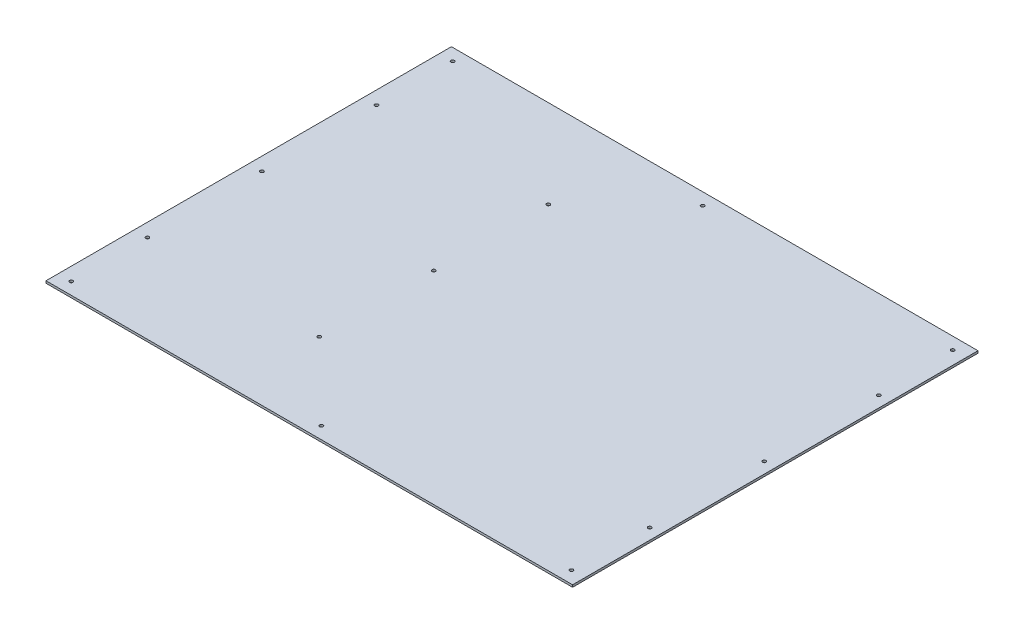
ISO-10303-21;
HEADER;
FILE_DESCRIPTION(('STEP AP214'),'2;1');
FILE_NAME('part.step','',(''),(''),'','','');
FILE_SCHEMA(('AUTOMOTIVE_DESIGN { 1 0 10303 214 1 1 1 1 }'));
ENDSEC;
DATA;
#1=APPLICATION_CONTEXT('core data for automotive mechanical design processes');
#2=APPLICATION_PROTOCOL_DEFINITION('international standard','automotive_design',2000,#1);
#3=PRODUCT_CONTEXT('',#1,'mechanical');
#4=PRODUCT('Part','Part','',(#3));
#5=PRODUCT_RELATED_PRODUCT_CATEGORY('part','',(#4));
#6=PRODUCT_DEFINITION_FORMATION('','',#4);
#7=PRODUCT_DEFINITION_CONTEXT('part definition',#1,'design');
#8=PRODUCT_DEFINITION('design','',#6,#7);
#9=PRODUCT_DEFINITION_SHAPE('','',#8);
#10=(LENGTH_UNIT() NAMED_UNIT(*) SI_UNIT(.MILLI.,.METRE.));
#11=(NAMED_UNIT(*) PLANE_ANGLE_UNIT() SI_UNIT($,.RADIAN.));
#12=(NAMED_UNIT(*) SI_UNIT($,.STERADIAN.) SOLID_ANGLE_UNIT());
#13=UNCERTAINTY_MEASURE_WITH_UNIT(LENGTH_MEASURE(1.E-05),#10,'distance_accuracy_value','');
#14=(GEOMETRIC_REPRESENTATION_CONTEXT(3) GLOBAL_UNCERTAINTY_ASSIGNED_CONTEXT((#13)) GLOBAL_UNIT_ASSIGNED_CONTEXT((#10,
#11,#12)) REPRESENTATION_CONTEXT('',''));
#15=CARTESIAN_POINT('',(0.,0.,0.));
#16=DIRECTION('',(0.,0.,1.));
#17=DIRECTION('',(1.,0.,0.));
#18=AXIS2_PLACEMENT_3D('',#15,#16,#17);
#19=CARTESIAN_POINT('',(0.,3.175,0.));
#20=DIRECTION('',(0.,-1.,0.));
#21=DIRECTION('',(0.,0.,-1.));
#22=AXIS2_PLACEMENT_3D('',#19,#20,#21);
#23=PLANE('',#22);
#24=CARTESIAN_POINT('',(266.7,3.175,-292.1));
#25=DIRECTION('',(0.,1.,0.));
#26=DIRECTION('',(0.,0.,1.));
#27=AXIS2_PLACEMENT_3D('',#24,#25,#26);
#28=CIRCLE('',#27,2.45744999999997);
#29=CARTESIAN_POINT('',(266.7,3.175,-289.64255));
#30=VERTEX_POINT('',#29);
#31=EDGE_CURVE('E197',#30,#30,#28,.T.);
#32=ORIENTED_EDGE('',*,*,#31,.F.);
#33=EDGE_LOOP('',(#32));
#34=FACE_BOUND('',#33,.T.);
#35=CARTESIAN_POINT('',(266.7,3.175,-127.));
#36=DIRECTION('',(0.,1.,0.));
#37=DIRECTION('',(0.,0.,1.));
#38=AXIS2_PLACEMENT_3D('',#35,#36,#37);
#39=CIRCLE('',#38,2.45744999999997);
#40=CARTESIAN_POINT('',(266.7,3.175,-124.54255));
#41=VERTEX_POINT('',#40);
#42=EDGE_CURVE('E191',#41,#41,#39,.T.);
#43=ORIENTED_EDGE('',*,*,#42,.F.);
#44=EDGE_LOOP('',(#43));
#45=FACE_BOUND('',#44,.T.);
#46=CARTESIAN_POINT('',(266.7,3.175,-457.2));
#47=DIRECTION('',(0.,1.,0.));
#48=DIRECTION('',(0.,0.,1.));
#49=AXIS2_PLACEMENT_3D('',#46,#47,#48);
#50=CIRCLE('',#49,2.45744999999997);
#51=CARTESIAN_POINT('',(266.7,3.175,-454.74255));
#52=VERTEX_POINT('',#51);
#53=EDGE_CURVE('E185',#52,#52,#50,.T.);
#54=ORIENTED_EDGE('',*,*,#53,.F.);
#55=EDGE_LOOP('',(#54));
#56=FACE_BOUND('',#55,.T.);
#57=CARTESIAN_POINT('',(19.05,3.175,-566.801));
#58=DIRECTION('',(0.,1.,0.));
#59=DIRECTION('',(0.,0.,1.));
#60=AXIS2_PLACEMENT_3D('',#57,#58,#59);
#61=CIRCLE('',#60,2.45744999999999);
#62=CARTESIAN_POINT('',(19.05,3.175,-564.34355));
#63=VERTEX_POINT('',#62);
#64=EDGE_CURVE('E179',#63,#63,#61,.T.);
#65=ORIENTED_EDGE('',*,*,#64,.F.);
#66=EDGE_LOOP('',(#65));
#67=FACE_BOUND('',#66,.T.);
#68=CARTESIAN_POINT('',(739.775,3.175,-566.801));
#69=DIRECTION('',(0.,1.,0.));
#70=DIRECTION('',(0.,0.,1.));
#71=AXIS2_PLACEMENT_3D('',#68,#69,#70);
#72=CIRCLE('',#71,2.45744999999997);
#73=CARTESIAN_POINT('',(739.775,3.175,-564.34355));
#74=VERTEX_POINT('',#73);
#75=EDGE_CURVE('E173',#74,#74,#72,.T.);
#76=ORIENTED_EDGE('',*,*,#75,.F.);
#77=EDGE_LOOP('',(#76));
#78=FACE_BOUND('',#77,.T.);
#79=CARTESIAN_POINT('',(19.0500000000001,3.175,-17.3990000000001));
#80=DIRECTION('',(0.,1.,0.));
#81=DIRECTION('',(0.,0.,1.));
#82=AXIS2_PLACEMENT_3D('',#79,#80,#81);
#83=CIRCLE('',#82,2.45744999999999);
#84=CARTESIAN_POINT('',(19.0500000000001,3.175,-14.9415500000001));
#85=VERTEX_POINT('',#84);
#86=EDGE_CURVE('E167',#85,#85,#83,.T.);
#87=ORIENTED_EDGE('',*,*,#86,.F.);
#88=EDGE_LOOP('',(#87));
#89=FACE_BOUND('',#88,.T.);
#90=CARTESIAN_POINT('',(739.775,3.175,-17.399));
#91=DIRECTION('',(0.,1.,0.));
#92=DIRECTION('',(0.,0.,1.));
#93=AXIS2_PLACEMENT_3D('',#90,#91,#92);
#94=CIRCLE('',#93,2.45744999999997);
#95=CARTESIAN_POINT('',(739.775,3.175,-14.9415500000001));
#96=VERTEX_POINT('',#95);
#97=EDGE_CURVE('E161',#96,#96,#94,.T.);
#98=ORIENTED_EDGE('',*,*,#97,.F.);
#99=EDGE_LOOP('',(#98));
#100=FACE_BOUND('',#99,.T.);
#101=CARTESIAN_POINT('',(19.05,3.175,-292.1));
#102=DIRECTION('',(0.,1.,0.));
#103=DIRECTION('',(0.,0.,1.));
#104=AXIS2_PLACEMENT_3D('',#101,#102,#103);
#105=CIRCLE('',#104,2.45744999999999);
#106=CARTESIAN_POINT('',(19.05,3.175,-289.64255));
#107=VERTEX_POINT('',#106);
#108=EDGE_CURVE('E149',#107,#107,#105,.T.);
#109=ORIENTED_EDGE('',*,*,#108,.F.);
#110=EDGE_LOOP('',(#109));
#111=FACE_BOUND('',#110,.T.);
#112=CARTESIAN_POINT('',(379.4125,3.175,-17.399));
#113=DIRECTION('',(0.,1.,0.));
#114=DIRECTION('',(0.,0.,1.));
#115=AXIS2_PLACEMENT_3D('',#112,#113,#114);
#116=CIRCLE('',#115,2.45744999999997);
#117=CARTESIAN_POINT('',(379.4125,3.175,-14.94155));
#118=VERTEX_POINT('',#117);
#119=EDGE_CURVE('E143',#118,#118,#116,.T.);
#120=ORIENTED_EDGE('',*,*,#119,.F.);
#121=EDGE_LOOP('',(#120));
#122=FACE_BOUND('',#121,.T.);
#123=CARTESIAN_POINT('',(742.95,3.175,-292.1));
#124=DIRECTION('',(0.,1.,0.));
#125=DIRECTION('',(0.,0.,1.));
#126=AXIS2_PLACEMENT_3D('',#123,#124,#125);
#127=CIRCLE('',#126,2.45744999999997);
#128=CARTESIAN_POINT('',(742.95,3.175,-289.64255));
#129=VERTEX_POINT('',#128);
#130=EDGE_CURVE('E137',#129,#129,#127,.T.);
#131=ORIENTED_EDGE('',*,*,#130,.F.);
#132=EDGE_LOOP('',(#131));
#133=FACE_BOUND('',#132,.T.);
#134=CARTESIAN_POINT('',(19.05,3.175,-457.2));
#135=DIRECTION('',(0.,1.,0.));
#136=DIRECTION('',(0.,0.,1.));
#137=AXIS2_PLACEMENT_3D('',#134,#135,#136);
#138=CIRCLE('',#137,2.45744999999999);
#139=CARTESIAN_POINT('',(19.05,3.175,-454.74255));
#140=VERTEX_POINT('',#139);
#141=EDGE_CURVE('E131',#140,#140,#138,.T.);
#142=ORIENTED_EDGE('',*,*,#141,.F.);
#143=EDGE_LOOP('',(#142));
#144=FACE_BOUND('',#143,.T.);
#145=CARTESIAN_POINT('',(19.05,3.175,-127.));
#146=DIRECTION('',(0.,1.,0.));
#147=DIRECTION('',(0.,0.,1.));
#148=AXIS2_PLACEMENT_3D('',#145,#146,#147);
#149=CIRCLE('',#148,2.45744999999999);
#150=CARTESIAN_POINT('',(19.05,3.175,-124.54255));
#151=VERTEX_POINT('',#150);
#152=EDGE_CURVE('E125',#151,#151,#149,.T.);
#153=ORIENTED_EDGE('',*,*,#152,.F.);
#154=EDGE_LOOP('',(#153));
#155=FACE_BOUND('',#154,.T.);
#156=CARTESIAN_POINT('',(742.95,3.175,-127.));
#157=DIRECTION('',(0.,1.,0.));
#158=DIRECTION('',(0.,0.,1.));
#159=AXIS2_PLACEMENT_3D('',#156,#157,#158);
#160=CIRCLE('',#159,2.45744999999997);
#161=CARTESIAN_POINT('',(742.95,3.175,-124.54255));
#162=VERTEX_POINT('',#161);
#163=EDGE_CURVE('E119',#162,#162,#160,.T.);
#164=ORIENTED_EDGE('',*,*,#163,.F.);
#165=EDGE_LOOP('',(#164));
#166=FACE_BOUND('',#165,.T.);
#167=CARTESIAN_POINT('',(742.95,3.175,-457.2));
#168=DIRECTION('',(0.,1.,0.));
#169=DIRECTION('',(0.,0.,1.));
#170=AXIS2_PLACEMENT_3D('',#167,#168,#169);
#171=CIRCLE('',#170,2.45744999999997);
#172=CARTESIAN_POINT('',(742.95,3.175,-454.74255));
#173=VERTEX_POINT('',#172);
#174=EDGE_CURVE('E113',#173,#173,#171,.T.);
#175=ORIENTED_EDGE('',*,*,#174,.F.);
#176=EDGE_LOOP('',(#175));
#177=FACE_BOUND('',#176,.T.);
#178=DIRECTION('',(0.,0.,1.));
#179=VECTOR('',#178,1.);
#180=CARTESIAN_POINT('',(0.,3.175,0.));
#181=LINE('',#180,#179);
#182=CARTESIAN_POINT('',(0.,3.175,-584.2));
#183=VERTEX_POINT('',#182);
#184=CARTESIAN_POINT('',(0.,3.175,0.));
#185=VERTEX_POINT('',#184);
#186=EDGE_CURVE('E84',#183,#185,#181,.T.);
#187=ORIENTED_EDGE('',*,*,#186,.T.);
#188=DIRECTION('',(1.,0.,0.));
#189=VECTOR('',#188,1.);
#190=CARTESIAN_POINT('',(0.,3.175,0.));
#191=LINE('',#190,#189);
#192=CARTESIAN_POINT('',(758.825,3.175,0.));
#193=VERTEX_POINT('',#192);
#194=EDGE_CURVE('E79',#185,#193,#191,.T.);
#195=ORIENTED_EDGE('',*,*,#194,.T.);
#196=DIRECTION('',(0.,0.,-1.));
#197=VECTOR('',#196,1.);
#198=CARTESIAN_POINT('',(758.825,3.175,0.));
#199=LINE('',#198,#197);
#200=CARTESIAN_POINT('',(758.825,3.175,-584.2));
#201=VERTEX_POINT('',#200);
#202=EDGE_CURVE('E82',#193,#201,#199,.T.);
#203=ORIENTED_EDGE('',*,*,#202,.T.);
#204=DIRECTION('',(-1.,0.,0.));
#205=VECTOR('',#204,1.);
#206=CARTESIAN_POINT('',(0.,3.175,-584.2));
#207=LINE('',#206,#205);
#208=EDGE_CURVE('E49',#201,#183,#207,.T.);
#209=ORIENTED_EDGE('',*,*,#208,.T.);
#210=EDGE_LOOP('',(#187,#195,#203,#209));
#211=FACE_BOUND('',#210,.T.);
#212=CARTESIAN_POINT('',(379.4125,3.175,-566.801));
#213=DIRECTION('',(0.,1.,0.));
#214=DIRECTION('',(0.,0.,1.));
#215=AXIS2_PLACEMENT_3D('',#212,#213,#214);
#216=CIRCLE('',#215,2.45744999999997);
#217=CARTESIAN_POINT('',(379.4125,3.175,-564.34355));
#218=VERTEX_POINT('',#217);
#219=EDGE_CURVE('E155',#218,#218,#216,.T.);
#220=ORIENTED_EDGE('',*,*,#219,.F.);
#221=EDGE_LOOP('',(#220));
#222=FACE_BOUND('',#221,.T.);
#223=ADVANCED_FACE('F32',(#34,#45,#56,#67,#78,#89,#100,#111,#122,#133,#144,#155,#166,#177,#211,
#222),#23,.F.);
#224=CARTESIAN_POINT('',(0.,0.,0.));
#225=DIRECTION('',(0.,-1.,0.));
#226=DIRECTION('',(0.,0.,-1.));
#227=AXIS2_PLACEMENT_3D('',#224,#225,#226);
#228=PLANE('',#227);
#229=CARTESIAN_POINT('',(266.7,0.,-292.1));
#230=DIRECTION('',(0.,1.,0.));
#231=DIRECTION('',(0.,0.,1.));
#232=AXIS2_PLACEMENT_3D('',#229,#230,#231);
#233=CIRCLE('',#232,2.45744999999997);
#234=CARTESIAN_POINT('',(266.7,0.,-289.64255));
#235=VERTEX_POINT('',#234);
#236=EDGE_CURVE('E194',#235,#235,#233,.T.);
#237=ORIENTED_EDGE('',*,*,#236,.T.);
#238=EDGE_LOOP('',(#237));
#239=FACE_BOUND('',#238,.T.);
#240=CARTESIAN_POINT('',(266.7,0.,-127.));
#241=DIRECTION('',(0.,1.,0.));
#242=DIRECTION('',(0.,0.,1.));
#243=AXIS2_PLACEMENT_3D('',#240,#241,#242);
#244=CIRCLE('',#243,2.45744999999997);
#245=CARTESIAN_POINT('',(266.7,0.,-124.54255));
#246=VERTEX_POINT('',#245);
#247=EDGE_CURVE('E188',#246,#246,#244,.T.);
#248=ORIENTED_EDGE('',*,*,#247,.T.);
#249=EDGE_LOOP('',(#248));
#250=FACE_BOUND('',#249,.T.);
#251=CARTESIAN_POINT('',(266.7,0.,-457.2));
#252=DIRECTION('',(0.,1.,0.));
#253=DIRECTION('',(0.,0.,1.));
#254=AXIS2_PLACEMENT_3D('',#251,#252,#253);
#255=CIRCLE('',#254,2.45744999999997);
#256=CARTESIAN_POINT('',(266.7,0.,-454.74255));
#257=VERTEX_POINT('',#256);
#258=EDGE_CURVE('E182',#257,#257,#255,.T.);
#259=ORIENTED_EDGE('',*,*,#258,.T.);
#260=EDGE_LOOP('',(#259));
#261=FACE_BOUND('',#260,.T.);
#262=CARTESIAN_POINT('',(19.05,0.,-566.801));
#263=DIRECTION('',(0.,1.,0.));
#264=DIRECTION('',(0.,0.,1.));
#265=AXIS2_PLACEMENT_3D('',#262,#263,#264);
#266=CIRCLE('',#265,2.45745);
#267=CARTESIAN_POINT('',(19.05,0.,-564.34355));
#268=VERTEX_POINT('',#267);
#269=EDGE_CURVE('E176',#268,#268,#266,.T.);
#270=ORIENTED_EDGE('',*,*,#269,.T.);
#271=EDGE_LOOP('',(#270));
#272=FACE_BOUND('',#271,.T.);
#273=CARTESIAN_POINT('',(739.775,0.,-566.801));
#274=DIRECTION('',(0.,1.,0.));
#275=DIRECTION('',(0.,0.,1.));
#276=AXIS2_PLACEMENT_3D('',#273,#274,#275);
#277=CIRCLE('',#276,2.45744999999997);
#278=CARTESIAN_POINT('',(739.775,0.,-564.34355));
#279=VERTEX_POINT('',#278);
#280=EDGE_CURVE('E170',#279,#279,#277,.T.);
#281=ORIENTED_EDGE('',*,*,#280,.T.);
#282=EDGE_LOOP('',(#281));
#283=FACE_BOUND('',#282,.T.);
#284=CARTESIAN_POINT('',(19.0500000000001,0.,-17.3990000000001));
#285=DIRECTION('',(0.,1.,0.));
#286=DIRECTION('',(0.,0.,1.));
#287=AXIS2_PLACEMENT_3D('',#284,#285,#286);
#288=CIRCLE('',#287,2.45745);
#289=CARTESIAN_POINT('',(19.0500000000001,0.,-14.9415500000001));
#290=VERTEX_POINT('',#289);
#291=EDGE_CURVE('E164',#290,#290,#288,.T.);
#292=ORIENTED_EDGE('',*,*,#291,.T.);
#293=EDGE_LOOP('',(#292));
#294=FACE_BOUND('',#293,.T.);
#295=CARTESIAN_POINT('',(739.775,0.,-17.399));
#296=DIRECTION('',(0.,1.,0.));
#297=DIRECTION('',(0.,0.,1.));
#298=AXIS2_PLACEMENT_3D('',#295,#296,#297);
#299=CIRCLE('',#298,2.45744999999997);
#300=CARTESIAN_POINT('',(739.775,0.,-14.9415500000001));
#301=VERTEX_POINT('',#300);
#302=EDGE_CURVE('E158',#301,#301,#299,.T.);
#303=ORIENTED_EDGE('',*,*,#302,.T.);
#304=EDGE_LOOP('',(#303));
#305=FACE_BOUND('',#304,.T.);
#306=CARTESIAN_POINT('',(379.4125,0.,-566.801));
#307=DIRECTION('',(0.,1.,0.));
#308=DIRECTION('',(0.,0.,1.));
#309=AXIS2_PLACEMENT_3D('',#306,#307,#308);
#310=CIRCLE('',#309,2.45744999999997);
#311=CARTESIAN_POINT('',(379.4125,0.,-564.34355));
#312=VERTEX_POINT('',#311);
#313=EDGE_CURVE('E152',#312,#312,#310,.T.);
#314=ORIENTED_EDGE('',*,*,#313,.T.);
#315=EDGE_LOOP('',(#314));
#316=FACE_BOUND('',#315,.T.);
#317=CARTESIAN_POINT('',(19.05,0.,-292.1));
#318=DIRECTION('',(0.,1.,0.));
#319=DIRECTION('',(0.,0.,1.));
#320=AXIS2_PLACEMENT_3D('',#317,#318,#319);
#321=CIRCLE('',#320,2.45745);
#322=CARTESIAN_POINT('',(19.05,0.,-289.64255));
#323=VERTEX_POINT('',#322);
#324=EDGE_CURVE('E146',#323,#323,#321,.T.);
#325=ORIENTED_EDGE('',*,*,#324,.T.);
#326=EDGE_LOOP('',(#325));
#327=FACE_BOUND('',#326,.T.);
#328=CARTESIAN_POINT('',(379.4125,0.,-17.399));
#329=DIRECTION('',(0.,1.,0.));
#330=DIRECTION('',(0.,0.,1.));
#331=AXIS2_PLACEMENT_3D('',#328,#329,#330);
#332=CIRCLE('',#331,2.45744999999997);
#333=CARTESIAN_POINT('',(379.4125,0.,-14.94155));
#334=VERTEX_POINT('',#333);
#335=EDGE_CURVE('E140',#334,#334,#332,.T.);
#336=ORIENTED_EDGE('',*,*,#335,.T.);
#337=EDGE_LOOP('',(#336));
#338=FACE_BOUND('',#337,.T.);
#339=CARTESIAN_POINT('',(742.95,0.,-292.1));
#340=DIRECTION('',(0.,1.,0.));
#341=DIRECTION('',(0.,0.,1.));
#342=AXIS2_PLACEMENT_3D('',#339,#340,#341);
#343=CIRCLE('',#342,2.45744999999997);
#344=CARTESIAN_POINT('',(742.95,0.,-289.64255));
#345=VERTEX_POINT('',#344);
#346=EDGE_CURVE('E134',#345,#345,#343,.T.);
#347=ORIENTED_EDGE('',*,*,#346,.T.);
#348=EDGE_LOOP('',(#347));
#349=FACE_BOUND('',#348,.T.);
#350=CARTESIAN_POINT('',(19.05,0.,-457.2));
#351=DIRECTION('',(0.,1.,0.));
#352=DIRECTION('',(0.,0.,1.));
#353=AXIS2_PLACEMENT_3D('',#350,#351,#352);
#354=CIRCLE('',#353,2.45745);
#355=CARTESIAN_POINT('',(19.05,0.,-454.74255));
#356=VERTEX_POINT('',#355);
#357=EDGE_CURVE('E128',#356,#356,#354,.T.);
#358=ORIENTED_EDGE('',*,*,#357,.T.);
#359=EDGE_LOOP('',(#358));
#360=FACE_BOUND('',#359,.T.);
#361=CARTESIAN_POINT('',(19.05,0.,-127.));
#362=DIRECTION('',(0.,1.,0.));
#363=DIRECTION('',(0.,0.,1.));
#364=AXIS2_PLACEMENT_3D('',#361,#362,#363);
#365=CIRCLE('',#364,2.45745);
#366=CARTESIAN_POINT('',(19.05,0.,-124.54255));
#367=VERTEX_POINT('',#366);
#368=EDGE_CURVE('E122',#367,#367,#365,.T.);
#369=ORIENTED_EDGE('',*,*,#368,.T.);
#370=EDGE_LOOP('',(#369));
#371=FACE_BOUND('',#370,.T.);
#372=DIRECTION('',(0.,0.,1.));
#373=VECTOR('',#372,1.);
#374=CARTESIAN_POINT('',(0.,0.,0.));
#375=LINE('',#374,#373);
#376=CARTESIAN_POINT('',(0.,0.,-584.2));
#377=VERTEX_POINT('',#376);
#378=CARTESIAN_POINT('',(0.,0.,0.));
#379=VERTEX_POINT('',#378);
#380=EDGE_CURVE('E96',#377,#379,#375,.T.);
#381=ORIENTED_EDGE('',*,*,#380,.F.);
#382=DIRECTION('',(-1.,0.,0.));
#383=VECTOR('',#382,1.);
#384=CARTESIAN_POINT('',(0.,0.,-584.2));
#385=LINE('',#384,#383);
#386=CARTESIAN_POINT('',(758.825,0.,-584.2));
#387=VERTEX_POINT('',#386);
#388=EDGE_CURVE('E72',#387,#377,#385,.T.);
#389=ORIENTED_EDGE('',*,*,#388,.F.);
#390=DIRECTION('',(0.,0.,-1.));
#391=VECTOR('',#390,1.);
#392=CARTESIAN_POINT('',(758.825,0.,0.));
#393=LINE('',#392,#391);
#394=CARTESIAN_POINT('',(758.825,0.,0.));
#395=VERTEX_POINT('',#394);
#396=EDGE_CURVE('E66',#395,#387,#393,.T.);
#397=ORIENTED_EDGE('',*,*,#396,.F.);
#398=DIRECTION('',(1.,0.,0.));
#399=VECTOR('',#398,1.);
#400=CARTESIAN_POINT('',(0.,0.,0.));
#401=LINE('',#400,#399);
#402=EDGE_CURVE('E88',#379,#395,#401,.T.);
#403=ORIENTED_EDGE('',*,*,#402,.F.);
#404=EDGE_LOOP('',(#381,#389,#397,#403));
#405=FACE_BOUND('',#404,.T.);
#406=CARTESIAN_POINT('',(742.95,0.,-457.2));
#407=DIRECTION('',(0.,1.,0.));
#408=DIRECTION('',(0.,0.,1.));
#409=AXIS2_PLACEMENT_3D('',#406,#407,#408);
#410=CIRCLE('',#409,2.45744999999997);
#411=CARTESIAN_POINT('',(742.95,0.,-454.74255));
#412=VERTEX_POINT('',#411);
#413=EDGE_CURVE('E99',#412,#412,#410,.T.);
#414=ORIENTED_EDGE('',*,*,#413,.T.);
#415=EDGE_LOOP('',(#414));
#416=FACE_BOUND('',#415,.T.);
#417=CARTESIAN_POINT('',(742.95,0.,-127.));
#418=DIRECTION('',(0.,1.,0.));
#419=DIRECTION('',(0.,0.,1.));
#420=AXIS2_PLACEMENT_3D('',#417,#418,#419);
#421=CIRCLE('',#420,2.45744999999997);
#422=CARTESIAN_POINT('',(742.95,0.,-124.54255));
#423=VERTEX_POINT('',#422);
#424=EDGE_CURVE('E116',#423,#423,#421,.T.);
#425=ORIENTED_EDGE('',*,*,#424,.T.);
#426=EDGE_LOOP('',(#425));
#427=FACE_BOUND('',#426,.T.);
#428=ADVANCED_FACE('F107',(#239,#250,#261,#272,#283,#294,#305,#316,#327,#338,#349,#360,#371,
#405,#416,#427),#228,.T.);
#429=CARTESIAN_POINT('',(0.,3.175,0.));
#430=DIRECTION('',(1.,0.,0.));
#431=DIRECTION('',(0.,0.,-1.));
#432=AXIS2_PLACEMENT_3D('',#429,#430,#431);
#433=PLANE('',#432);
#434=ORIENTED_EDGE('',*,*,#380,.T.);
#435=DIRECTION('',(0.,-1.,0.));
#436=VECTOR('',#435,1.);
#437=CARTESIAN_POINT('',(0.,3.175,0.));
#438=LINE('',#437,#436);
#439=EDGE_CURVE('E11',#185,#379,#438,.T.);
#440=ORIENTED_EDGE('',*,*,#439,.F.);
#441=ORIENTED_EDGE('',*,*,#186,.F.);
#442=DIRECTION('',(0.,-1.,0.));
#443=VECTOR('',#442,1.);
#444=CARTESIAN_POINT('',(0.,3.175,-584.2));
#445=LINE('',#444,#443);
#446=EDGE_CURVE('E92',#183,#377,#445,.T.);
#447=ORIENTED_EDGE('',*,*,#446,.T.);
#448=EDGE_LOOP('',(#434,#440,#441,#447));
#449=FACE_BOUND('',#448,.T.);
#450=ADVANCED_FACE('F34',(#449),#433,.F.);
#451=CARTESIAN_POINT('',(0.,3.175,0.));
#452=DIRECTION('',(0.,0.,-1.));
#453=DIRECTION('',(-1.,0.,0.));
#454=AXIS2_PLACEMENT_3D('',#451,#452,#453);
#455=PLANE('',#454);
#456=ORIENTED_EDGE('',*,*,#402,.T.);
#457=DIRECTION('',(0.,-1.,0.));
#458=VECTOR('',#457,1.);
#459=CARTESIAN_POINT('',(758.825,3.175,0.));
#460=LINE('',#459,#458);
#461=EDGE_CURVE('E41',#193,#395,#460,.T.);
#462=ORIENTED_EDGE('',*,*,#461,.F.);
#463=ORIENTED_EDGE('',*,*,#194,.F.);
#464=ORIENTED_EDGE('',*,*,#439,.T.);
#465=EDGE_LOOP('',(#456,#462,#463,#464));
#466=FACE_BOUND('',#465,.T.);
#467=ADVANCED_FACE('F87',(#466),#455,.F.);
#468=CARTESIAN_POINT('',(758.825,3.175,0.));
#469=DIRECTION('',(-1.,0.,0.));
#470=DIRECTION('',(0.,0.,1.));
#471=AXIS2_PLACEMENT_3D('',#468,#469,#470);
#472=PLANE('',#471);
#473=ORIENTED_EDGE('',*,*,#396,.T.);
#474=DIRECTION('',(0.,-1.,0.));
#475=VECTOR('',#474,1.);
#476=CARTESIAN_POINT('',(758.825,3.175,-584.2));
#477=LINE('',#476,#475);
#478=EDGE_CURVE('E89',#201,#387,#477,.T.);
#479=ORIENTED_EDGE('',*,*,#478,.F.);
#480=ORIENTED_EDGE('',*,*,#202,.F.);
#481=ORIENTED_EDGE('',*,*,#461,.T.);
#482=EDGE_LOOP('',(#473,#479,#480,#481));
#483=FACE_BOUND('',#482,.T.);
#484=ADVANCED_FACE('F90',(#483),#472,.F.);
#485=CARTESIAN_POINT('',(0.,3.175,-584.2));
#486=DIRECTION('',(0.,0.,1.));
#487=DIRECTION('',(1.,0.,0.));
#488=AXIS2_PLACEMENT_3D('',#485,#486,#487);
#489=PLANE('',#488);
#490=ORIENTED_EDGE('',*,*,#388,.T.);
#491=ORIENTED_EDGE('',*,*,#446,.F.);
#492=ORIENTED_EDGE('',*,*,#208,.F.);
#493=ORIENTED_EDGE('',*,*,#478,.T.);
#494=EDGE_LOOP('',(#490,#491,#492,#493));
#495=FACE_BOUND('',#494,.T.);
#496=ADVANCED_FACE('F104',(#495),#489,.F.);
#497=CARTESIAN_POINT('',(742.95,3.175,-457.2));
#498=DIRECTION('',(0.,1.,0.));
#499=DIRECTION('',(0.,0.,1.));
#500=AXIS2_PLACEMENT_3D('',#497,#498,#499);
#501=CYLINDRICAL_SURFACE('',#500,2.45744999999997);
#502=ORIENTED_EDGE('',*,*,#413,.F.);
#503=EDGE_LOOP('',(#502));
#504=FACE_BOUND('',#503,.T.);
#505=ORIENTED_EDGE('',*,*,#174,.T.);
#506=EDGE_LOOP('',(#505));
#507=FACE_BOUND('',#506,.T.);
#508=ADVANCED_FACE('F232',(#504,#507),#501,.F.);
#509=CARTESIAN_POINT('',(742.95,3.175,-127.));
#510=DIRECTION('',(0.,1.,0.));
#511=DIRECTION('',(0.,0.,1.));
#512=AXIS2_PLACEMENT_3D('',#509,#510,#511);
#513=CYLINDRICAL_SURFACE('',#512,2.45744999999997);
#514=ORIENTED_EDGE('',*,*,#424,.F.);
#515=EDGE_LOOP('',(#514));
#516=FACE_BOUND('',#515,.T.);
#517=ORIENTED_EDGE('',*,*,#163,.T.);
#518=EDGE_LOOP('',(#517));
#519=FACE_BOUND('',#518,.T.);
#520=ADVANCED_FACE('F234',(#516,#519),#513,.F.);
#521=CARTESIAN_POINT('',(19.05,3.175,-127.));
#522=DIRECTION('',(0.,1.,0.));
#523=DIRECTION('',(0.,0.,1.));
#524=AXIS2_PLACEMENT_3D('',#521,#522,#523);
#525=CYLINDRICAL_SURFACE('',#524,2.45744999999999);
#526=ORIENTED_EDGE('',*,*,#368,.F.);
#527=EDGE_LOOP('',(#526));
#528=FACE_BOUND('',#527,.T.);
#529=ORIENTED_EDGE('',*,*,#152,.T.);
#530=EDGE_LOOP('',(#529));
#531=FACE_BOUND('',#530,.T.);
#532=ADVANCED_FACE('F241',(#528,#531),#525,.F.);
#533=CARTESIAN_POINT('',(19.05,3.175,-457.2));
#534=DIRECTION('',(0.,1.,0.));
#535=DIRECTION('',(0.,0.,1.));
#536=AXIS2_PLACEMENT_3D('',#533,#534,#535);
#537=CYLINDRICAL_SURFACE('',#536,2.45744999999999);
#538=ORIENTED_EDGE('',*,*,#357,.F.);
#539=EDGE_LOOP('',(#538));
#540=FACE_BOUND('',#539,.T.);
#541=ORIENTED_EDGE('',*,*,#141,.T.);
#542=EDGE_LOOP('',(#541));
#543=FACE_BOUND('',#542,.T.);
#544=ADVANCED_FACE('F351',(#540,#543),#537,.F.);
#545=CARTESIAN_POINT('',(742.95,3.175,-292.1));
#546=DIRECTION('',(0.,1.,0.));
#547=DIRECTION('',(0.,0.,1.));
#548=AXIS2_PLACEMENT_3D('',#545,#546,#547);
#549=CYLINDRICAL_SURFACE('',#548,2.45744999999997);
#550=ORIENTED_EDGE('',*,*,#346,.F.);
#551=EDGE_LOOP('',(#550));
#552=FACE_BOUND('',#551,.T.);
#553=ORIENTED_EDGE('',*,*,#130,.T.);
#554=EDGE_LOOP('',(#553));
#555=FACE_BOUND('',#554,.T.);
#556=ADVANCED_FACE('F341',(#552,#555),#549,.F.);
#557=CARTESIAN_POINT('',(379.4125,3.175,-17.399));
#558=DIRECTION('',(0.,1.,0.));
#559=DIRECTION('',(0.,0.,1.));
#560=AXIS2_PLACEMENT_3D('',#557,#558,#559);
#561=CYLINDRICAL_SURFACE('',#560,2.45744999999997);
#562=ORIENTED_EDGE('',*,*,#335,.F.);
#563=EDGE_LOOP('',(#562));
#564=FACE_BOUND('',#563,.T.);
#565=ORIENTED_EDGE('',*,*,#119,.T.);
#566=EDGE_LOOP('',(#565));
#567=FACE_BOUND('',#566,.T.);
#568=ADVANCED_FACE('F331',(#564,#567),#561,.F.);
#569=CARTESIAN_POINT('',(19.05,3.175,-292.1));
#570=DIRECTION('',(0.,1.,0.));
#571=DIRECTION('',(0.,0.,1.));
#572=AXIS2_PLACEMENT_3D('',#569,#570,#571);
#573=CYLINDRICAL_SURFACE('',#572,2.45744999999999);
#574=ORIENTED_EDGE('',*,*,#324,.F.);
#575=EDGE_LOOP('',(#574));
#576=FACE_BOUND('',#575,.T.);
#577=ORIENTED_EDGE('',*,*,#108,.T.);
#578=EDGE_LOOP('',(#577));
#579=FACE_BOUND('',#578,.T.);
#580=ADVANCED_FACE('F321',(#576,#579),#573,.F.);
#581=CARTESIAN_POINT('',(379.4125,3.175,-566.801));
#582=DIRECTION('',(0.,1.,0.));
#583=DIRECTION('',(0.,0.,1.));
#584=AXIS2_PLACEMENT_3D('',#581,#582,#583);
#585=CYLINDRICAL_SURFACE('',#584,2.45744999999997);
#586=ORIENTED_EDGE('',*,*,#313,.F.);
#587=EDGE_LOOP('',(#586));
#588=FACE_BOUND('',#587,.T.);
#589=ORIENTED_EDGE('',*,*,#219,.T.);
#590=EDGE_LOOP('',(#589));
#591=FACE_BOUND('',#590,.T.);
#592=ADVANCED_FACE('F311',(#588,#591),#585,.F.);
#593=CARTESIAN_POINT('',(739.775,3.175,-17.399));
#594=DIRECTION('',(0.,1.,0.));
#595=DIRECTION('',(0.,0.,1.));
#596=AXIS2_PLACEMENT_3D('',#593,#594,#595);
#597=CYLINDRICAL_SURFACE('',#596,2.45744999999997);
#598=ORIENTED_EDGE('',*,*,#302,.F.);
#599=EDGE_LOOP('',(#598));
#600=FACE_BOUND('',#599,.T.);
#601=ORIENTED_EDGE('',*,*,#97,.T.);
#602=EDGE_LOOP('',(#601));
#603=FACE_BOUND('',#602,.T.);
#604=ADVANCED_FACE('F301',(#600,#603),#597,.F.);
#605=CARTESIAN_POINT('',(19.0500000000001,3.175,-17.3990000000001));
#606=DIRECTION('',(0.,1.,0.));
#607=DIRECTION('',(0.,0.,1.));
#608=AXIS2_PLACEMENT_3D('',#605,#606,#607);
#609=CYLINDRICAL_SURFACE('',#608,2.45744999999999);
#610=ORIENTED_EDGE('',*,*,#291,.F.);
#611=EDGE_LOOP('',(#610));
#612=FACE_BOUND('',#611,.T.);
#613=ORIENTED_EDGE('',*,*,#86,.T.);
#614=EDGE_LOOP('',(#613));
#615=FACE_BOUND('',#614,.T.);
#616=ADVANCED_FACE('F291',(#612,#615),#609,.F.);
#617=CARTESIAN_POINT('',(739.775,3.175,-566.801));
#618=DIRECTION('',(0.,1.,0.));
#619=DIRECTION('',(0.,0.,1.));
#620=AXIS2_PLACEMENT_3D('',#617,#618,#619);
#621=CYLINDRICAL_SURFACE('',#620,2.45744999999997);
#622=ORIENTED_EDGE('',*,*,#280,.F.);
#623=EDGE_LOOP('',(#622));
#624=FACE_BOUND('',#623,.T.);
#625=ORIENTED_EDGE('',*,*,#75,.T.);
#626=EDGE_LOOP('',(#625));
#627=FACE_BOUND('',#626,.T.);
#628=ADVANCED_FACE('F279',(#624,#627),#621,.F.);
#629=CARTESIAN_POINT('',(19.05,3.175,-566.801));
#630=DIRECTION('',(0.,1.,0.));
#631=DIRECTION('',(0.,0.,1.));
#632=AXIS2_PLACEMENT_3D('',#629,#630,#631);
#633=CYLINDRICAL_SURFACE('',#632,2.45744999999999);
#634=ORIENTED_EDGE('',*,*,#269,.F.);
#635=EDGE_LOOP('',(#634));
#636=FACE_BOUND('',#635,.T.);
#637=ORIENTED_EDGE('',*,*,#64,.T.);
#638=EDGE_LOOP('',(#637));
#639=FACE_BOUND('',#638,.T.);
#640=ADVANCED_FACE('F273',(#636,#639),#633,.F.);
#641=CARTESIAN_POINT('',(266.7,3.175,-457.2));
#642=DIRECTION('',(0.,1.,0.));
#643=DIRECTION('',(0.,0.,1.));
#644=AXIS2_PLACEMENT_3D('',#641,#642,#643);
#645=CYLINDRICAL_SURFACE('',#644,2.45744999999997);
#646=ORIENTED_EDGE('',*,*,#258,.F.);
#647=EDGE_LOOP('',(#646));
#648=FACE_BOUND('',#647,.T.);
#649=ORIENTED_EDGE('',*,*,#53,.T.);
#650=EDGE_LOOP('',(#649));
#651=FACE_BOUND('',#650,.T.);
#652=ADVANCED_FACE('F278',(#648,#651),#645,.F.);
#653=CARTESIAN_POINT('',(266.7,3.175,-127.));
#654=DIRECTION('',(0.,1.,0.));
#655=DIRECTION('',(0.,0.,1.));
#656=AXIS2_PLACEMENT_3D('',#653,#654,#655);
#657=CYLINDRICAL_SURFACE('',#656,2.45744999999997);
#658=ORIENTED_EDGE('',*,*,#247,.F.);
#659=EDGE_LOOP('',(#658));
#660=FACE_BOUND('',#659,.T.);
#661=ORIENTED_EDGE('',*,*,#42,.T.);
#662=EDGE_LOOP('',(#661));
#663=FACE_BOUND('',#662,.T.);
#664=ADVANCED_FACE('F406',(#660,#663),#657,.F.);
#665=CARTESIAN_POINT('',(266.7,3.175,-292.1));
#666=DIRECTION('',(0.,1.,0.));
#667=DIRECTION('',(0.,0.,1.));
#668=AXIS2_PLACEMENT_3D('',#665,#666,#667);
#669=CYLINDRICAL_SURFACE('',#668,2.45744999999997);
#670=ORIENTED_EDGE('',*,*,#236,.F.);
#671=EDGE_LOOP('',(#670));
#672=FACE_BOUND('',#671,.T.);
#673=ORIENTED_EDGE('',*,*,#31,.T.);
#674=EDGE_LOOP('',(#673));
#675=FACE_BOUND('',#674,.T.);
#676=ADVANCED_FACE('F201',(#672,#675),#669,.F.);
#677=CLOSED_SHELL('',(#223,#428,#450,#467,#484,#496,#508,#520,#532,#544,#556,#568,#580,#592,
#604,#616,#628,#640,#652,#664,#676));
#678=MANIFOLD_SOLID_BREP('B2',#677);
#679=ADVANCED_BREP_SHAPE_REPRESENTATION('',(#18,#678),#14);
#680=SHAPE_DEFINITION_REPRESENTATION(#9,#679);
ENDSEC;
END-ISO-10303-21;
